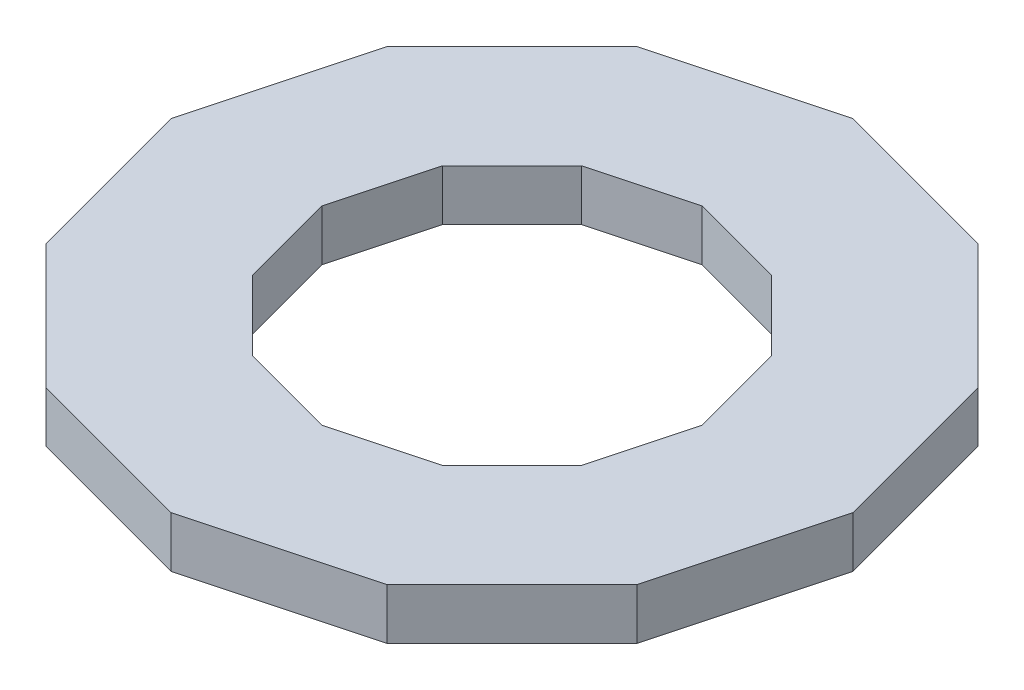
ISO-10303-21;
HEADER;
FILE_DESCRIPTION(('STEP AP214'),'2;1');
FILE_NAME('part.step','',(''),(''),'','','');
FILE_SCHEMA(('AUTOMOTIVE_DESIGN { 1 0 10303 214 1 1 1 1 }'));
ENDSEC;
DATA;
#1=APPLICATION_CONTEXT('core data for automotive mechanical design processes');
#2=APPLICATION_PROTOCOL_DEFINITION('international standard','automotive_design',2000,#1);
#3=PRODUCT_CONTEXT('',#1,'mechanical');
#4=PRODUCT('Part','Part','',(#3));
#5=PRODUCT_RELATED_PRODUCT_CATEGORY('part','',(#4));
#6=PRODUCT_DEFINITION_FORMATION('','',#4);
#7=PRODUCT_DEFINITION_CONTEXT('part definition',#1,'design');
#8=PRODUCT_DEFINITION('design','',#6,#7);
#9=PRODUCT_DEFINITION_SHAPE('','',#8);
#10=(LENGTH_UNIT() NAMED_UNIT(*) SI_UNIT(.MILLI.,.METRE.));
#11=(NAMED_UNIT(*) PLANE_ANGLE_UNIT() SI_UNIT($,.RADIAN.));
#12=(NAMED_UNIT(*) SI_UNIT($,.STERADIAN.) SOLID_ANGLE_UNIT());
#13=UNCERTAINTY_MEASURE_WITH_UNIT(LENGTH_MEASURE(1.E-05),#10,'distance_accuracy_value','');
#14=(GEOMETRIC_REPRESENTATION_CONTEXT(3) GLOBAL_UNCERTAINTY_ASSIGNED_CONTEXT((#13)) GLOBAL_UNIT_ASSIGNED_CONTEXT((#10,
#11,#12)) REPRESENTATION_CONTEXT('',''));
#15=CARTESIAN_POINT('',(0.,0.,0.));
#16=DIRECTION('',(0.,0.,1.));
#17=DIRECTION('',(1.,0.,0.));
#18=AXIS2_PLACEMENT_3D('',#15,#16,#17);
#19=CARTESIAN_POINT('',(0.,19.05,0.));
#20=DIRECTION('',(0.,1.,0.));
#21=DIRECTION('',(0.,0.,1.));
#22=AXIS2_PLACEMENT_3D('',#19,#20,#21);
#23=PLANE('',#22);
#24=DIRECTION('',(-0.25881904510252,0.,0.965925826289068));
#25=VECTOR('',#24,1.);
#26=CARTESIAN_POINT('',(-110.48707339769,19.05,-63.7897415681301));
#27=LINE('',#26,#25);
#28=CARTESIAN_POINT('',(-110.48707339769,19.05,-63.7897415681301));
#29=VERTEX_POINT('',#28);
#30=CARTESIAN_POINT('',(-127.57948313626,19.05,0.));
#31=VERTEX_POINT('',#30);
#32=EDGE_CURVE('E287',#29,#31,#27,.T.);
#33=ORIENTED_EDGE('',*,*,#32,.T.);
#34=DIRECTION('',(0.258819045102521,0.,0.965925826289068));
#35=VECTOR('',#34,1.);
#36=CARTESIAN_POINT('',(-127.57948313626,19.05,0.));
#37=LINE('',#36,#35);
#38=CARTESIAN_POINT('',(-110.48707339769,19.05,63.7897415681301));
#39=VERTEX_POINT('',#38);
#40=EDGE_CURVE('E290',#31,#39,#37,.T.);
#41=ORIENTED_EDGE('',*,*,#40,.T.);
#42=DIRECTION('',(0.707106781186548,0.,0.707106781186548));
#43=VECTOR('',#42,1.);
#44=CARTESIAN_POINT('',(-110.48707339769,19.05,63.7897415681301));
#45=LINE('',#44,#43);
#46=CARTESIAN_POINT('',(-63.78974156813,19.05,110.48707339769));
#47=VERTEX_POINT('',#46);
#48=EDGE_CURVE('E293',#39,#47,#45,.T.);
#49=ORIENTED_EDGE('',*,*,#48,.T.);
#50=DIRECTION('',(0.965925826289068,0.,0.25881904510252));
#51=VECTOR('',#50,1.);
#52=CARTESIAN_POINT('',(-63.78974156813,19.05,110.48707339769));
#53=LINE('',#52,#51);
#54=CARTESIAN_POINT('',(0.,19.05,127.57948313626));
#55=VERTEX_POINT('',#54);
#56=EDGE_CURVE('E295',#47,#55,#53,.T.);
#57=ORIENTED_EDGE('',*,*,#56,.T.);
#58=DIRECTION('',(0.965925826289068,0.,-0.258819045102521));
#59=VECTOR('',#58,1.);
#60=CARTESIAN_POINT('',(0.,19.05,127.57948313626));
#61=LINE('',#60,#59);
#62=CARTESIAN_POINT('',(63.7897415681301,19.05,110.48707339769));
#63=VERTEX_POINT('',#62);
#64=EDGE_CURVE('E297',#55,#63,#61,.T.);
#65=ORIENTED_EDGE('',*,*,#64,.T.);
#66=DIRECTION('',(0.707106781186547,0.,-0.707106781186548));
#67=VECTOR('',#66,1.);
#68=CARTESIAN_POINT('',(63.7897415681301,19.05,110.48707339769));
#69=LINE('',#68,#67);
#70=CARTESIAN_POINT('',(110.48707339769,19.05,63.78974156813));
#71=VERTEX_POINT('',#70);
#72=EDGE_CURVE('E299',#63,#71,#69,.T.);
#73=ORIENTED_EDGE('',*,*,#72,.T.);
#74=DIRECTION('',(0.25881904510252,0.,-0.965925826289068));
#75=VECTOR('',#74,1.);
#76=CARTESIAN_POINT('',(110.48707339769,19.05,63.78974156813));
#77=LINE('',#76,#75);
#78=CARTESIAN_POINT('',(127.57948313626,19.05,0.));
#79=VERTEX_POINT('',#78);
#80=EDGE_CURVE('E301',#71,#79,#77,.T.);
#81=ORIENTED_EDGE('',*,*,#80,.T.);
#82=DIRECTION('',(-0.258819045102521,0.,-0.965925826289068));
#83=VECTOR('',#82,1.);
#84=CARTESIAN_POINT('',(127.57948313626,19.05,0.));
#85=LINE('',#84,#83);
#86=CARTESIAN_POINT('',(110.48707339769,19.05,-63.78974156813));
#87=VERTEX_POINT('',#86);
#88=EDGE_CURVE('E303',#79,#87,#85,.T.);
#89=ORIENTED_EDGE('',*,*,#88,.T.);
#90=DIRECTION('',(-0.707106781186548,0.,-0.707106781186548));
#91=VECTOR('',#90,1.);
#92=CARTESIAN_POINT('',(110.48707339769,19.05,-63.78974156813));
#93=LINE('',#92,#91);
#94=CARTESIAN_POINT('',(63.78974156813,19.05,-110.48707339769));
#95=VERTEX_POINT('',#94);
#96=EDGE_CURVE('E305',#87,#95,#93,.T.);
#97=ORIENTED_EDGE('',*,*,#96,.T.);
#98=DIRECTION('',(-0.965925826289068,0.,-0.25881904510252));
#99=VECTOR('',#98,1.);
#100=CARTESIAN_POINT('',(63.78974156813,19.05,-110.48707339769));
#101=LINE('',#100,#99);
#102=CARTESIAN_POINT('',(0.,19.05,-127.57948313626));
#103=VERTEX_POINT('',#102);
#104=EDGE_CURVE('E307',#95,#103,#101,.T.);
#105=ORIENTED_EDGE('',*,*,#104,.T.);
#106=DIRECTION('',(-0.965925826289068,0.,0.258819045102521));
#107=VECTOR('',#106,1.);
#108=CARTESIAN_POINT('',(0.,19.05,-127.57948313626));
#109=LINE('',#108,#107);
#110=CARTESIAN_POINT('',(-63.7897415681301,19.05,-110.48707339769));
#111=VERTEX_POINT('',#110);
#112=EDGE_CURVE('E309',#103,#111,#109,.T.);
#113=ORIENTED_EDGE('',*,*,#112,.T.);
#114=DIRECTION('',(-0.707106781186547,0.,0.707106781186547));
#115=VECTOR('',#114,1.);
#116=CARTESIAN_POINT('',(-63.7897415681301,19.05,-110.48707339769));
#117=LINE('',#116,#115);
#118=EDGE_CURVE('E311',#111,#29,#117,.T.);
#119=ORIENTED_EDGE('',*,*,#118,.T.);
#120=EDGE_LOOP('',(#33,#41,#49,#57,#65,#73,#81,#89,#97,#105,#113,#119));
#121=FACE_BOUND('',#120,.T.);
#122=DIRECTION('',(0.258819045102521,0.,0.965925826289068));
#123=VECTOR('',#122,1.);
#124=CARTESIAN_POINT('',(-71.0430509240656,19.05,0.));
#125=LINE('',#124,#123);
#126=CARTESIAN_POINT('',(-71.0430509240656,19.05,0.));
#127=VERTEX_POINT('',#126);
#128=CARTESIAN_POINT('',(-61.5250868625923,19.05,35.5215254620328));
#129=VERTEX_POINT('',#128);
#130=EDGE_CURVE('E202',#127,#129,#125,.T.);
#131=ORIENTED_EDGE('',*,*,#130,.F.);
#132=DIRECTION('',(-0.258819045102521,0.,0.965925826289068));
#133=VECTOR('',#132,1.);
#134=CARTESIAN_POINT('',(-61.5250868625924,19.05,-35.5215254620328));
#135=LINE('',#134,#133);
#136=CARTESIAN_POINT('',(-61.5250868625924,19.05,-35.5215254620328));
#137=VERTEX_POINT('',#136);
#138=EDGE_CURVE('E194',#137,#127,#135,.T.);
#139=ORIENTED_EDGE('',*,*,#138,.F.);
#140=DIRECTION('',(-0.707106781186547,0.,0.707106781186548));
#141=VECTOR('',#140,1.);
#142=CARTESIAN_POINT('',(-35.5215254620328,19.05,-61.5250868625923));
#143=LINE('',#142,#141);
#144=CARTESIAN_POINT('',(-35.5215254620328,19.05,-61.5250868625923));
#145=VERTEX_POINT('',#144);
#146=EDGE_CURVE('E235',#145,#137,#143,.T.);
#147=ORIENTED_EDGE('',*,*,#146,.F.);
#148=DIRECTION('',(-0.965925826289068,0.,0.258819045102521));
#149=VECTOR('',#148,1.);
#150=CARTESIAN_POINT('',(0.,19.05,-71.0430509240656));
#151=LINE('',#150,#149);
#152=CARTESIAN_POINT('',(0.,19.05,-71.0430509240656));
#153=VERTEX_POINT('',#152);
#154=EDGE_CURVE('E233',#153,#145,#151,.T.);
#155=ORIENTED_EDGE('',*,*,#154,.F.);
#156=DIRECTION('',(-0.965925826289068,0.,-0.25881904510252));
#157=VECTOR('',#156,1.);
#158=CARTESIAN_POINT('',(35.5215254620329,19.05,-61.5250868625923));
#159=LINE('',#158,#157);
#160=CARTESIAN_POINT('',(35.5215254620329,19.05,-61.5250868625923));
#161=VERTEX_POINT('',#160);
#162=EDGE_CURVE('E231',#161,#153,#159,.T.);
#163=ORIENTED_EDGE('',*,*,#162,.F.);
#164=DIRECTION('',(-0.707106781186548,0.,-0.707106781186547));
#165=VECTOR('',#164,1.);
#166=CARTESIAN_POINT('',(61.5250868625924,19.05,-35.5215254620328));
#167=LINE('',#166,#165);
#168=CARTESIAN_POINT('',(61.5250868625924,19.05,-35.5215254620328));
#169=VERTEX_POINT('',#168);
#170=EDGE_CURVE('E229',#169,#161,#167,.T.);
#171=ORIENTED_EDGE('',*,*,#170,.F.);
#172=DIRECTION('',(-0.258819045102521,0.,-0.965925826289068));
#173=VECTOR('',#172,1.);
#174=CARTESIAN_POINT('',(71.0430509240656,19.05,0.));
#175=LINE('',#174,#173);
#176=CARTESIAN_POINT('',(71.0430509240656,19.05,0.));
#177=VERTEX_POINT('',#176);
#178=EDGE_CURVE('E227',#177,#169,#175,.T.);
#179=ORIENTED_EDGE('',*,*,#178,.F.);
#180=DIRECTION('',(0.25881904510252,0.,-0.965925826289069));
#181=VECTOR('',#180,1.);
#182=CARTESIAN_POINT('',(61.5250868625924,19.05,35.5215254620328));
#183=LINE('',#182,#181);
#184=CARTESIAN_POINT('',(61.5250868625924,19.05,35.5215254620328));
#185=VERTEX_POINT('',#184);
#186=EDGE_CURVE('E225',#185,#177,#183,.T.);
#187=ORIENTED_EDGE('',*,*,#186,.F.);
#188=DIRECTION('',(0.707106781186547,0.,-0.707106781186548));
#189=VECTOR('',#188,1.);
#190=CARTESIAN_POINT('',(35.5215254620328,19.05,61.5250868625923));
#191=LINE('',#190,#189);
#192=CARTESIAN_POINT('',(35.5215254620328,19.05,61.5250868625923));
#193=VERTEX_POINT('',#192);
#194=EDGE_CURVE('E223',#193,#185,#191,.T.);
#195=ORIENTED_EDGE('',*,*,#194,.F.);
#196=DIRECTION('',(0.965925826289068,0.,-0.258819045102521));
#197=VECTOR('',#196,1.);
#198=CARTESIAN_POINT('',(0.,19.05,71.0430509240656));
#199=LINE('',#198,#197);
#200=CARTESIAN_POINT('',(0.,19.05,71.0430509240656));
#201=VERTEX_POINT('',#200);
#202=EDGE_CURVE('E221',#201,#193,#199,.T.);
#203=ORIENTED_EDGE('',*,*,#202,.F.);
#204=DIRECTION('',(0.965925826289068,0.,0.25881904510252));
#205=VECTOR('',#204,1.);
#206=CARTESIAN_POINT('',(-35.5215254620328,19.05,61.5250868625924));
#207=LINE('',#206,#205);
#208=CARTESIAN_POINT('',(-35.5215254620328,19.05,61.5250868625924));
#209=VERTEX_POINT('',#208);
#210=EDGE_CURVE('E217',#209,#201,#207,.T.);
#211=ORIENTED_EDGE('',*,*,#210,.F.);
#212=DIRECTION('',(0.707106781186548,0.,0.707106781186547));
#213=VECTOR('',#212,1.);
#214=CARTESIAN_POINT('',(-61.5250868625923,19.05,35.5215254620328));
#215=LINE('',#214,#213);
#216=EDGE_CURVE('E215',#129,#209,#215,.T.);
#217=ORIENTED_EDGE('',*,*,#216,.F.);
#218=EDGE_LOOP('',(#131,#139,#147,#155,#163,#171,#179,#187,#195,#203,#211,#217));
#219=FACE_BOUND('',#218,.T.);
#220=ADVANCED_FACE('F33',(#121,#219),#23,.T.);
#221=CARTESIAN_POINT('',(0.,0.,0.));
#222=DIRECTION('',(0.,1.,0.));
#223=DIRECTION('',(0.,0.,1.));
#224=AXIS2_PLACEMENT_3D('',#221,#222,#223);
#225=PLANE('',#224);
#226=DIRECTION('',(-0.25881904510252,0.,0.965925826289068));
#227=VECTOR('',#226,1.);
#228=CARTESIAN_POINT('',(-110.48707339769,0.,-63.7897415681301));
#229=LINE('',#228,#227);
#230=CARTESIAN_POINT('',(-110.48707339769,0.,-63.7897415681301));
#231=VERTEX_POINT('',#230);
#232=CARTESIAN_POINT('',(-127.57948313626,0.,0.));
#233=VERTEX_POINT('',#232);
#234=EDGE_CURVE('E210',#231,#233,#229,.T.);
#235=ORIENTED_EDGE('',*,*,#234,.F.);
#236=DIRECTION('',(-0.707106781186547,0.,0.707106781186547));
#237=VECTOR('',#236,1.);
#238=CARTESIAN_POINT('',(-63.7897415681301,0.,-110.48707339769));
#239=LINE('',#238,#237);
#240=CARTESIAN_POINT('',(-63.7897415681301,0.,-110.48707339769));
#241=VERTEX_POINT('',#240);
#242=EDGE_CURVE('E291',#241,#231,#239,.T.);
#243=ORIENTED_EDGE('',*,*,#242,.F.);
#244=DIRECTION('',(-0.965925826289068,0.,0.258819045102521));
#245=VECTOR('',#244,1.);
#246=CARTESIAN_POINT('',(0.,0.,-127.57948313626));
#247=LINE('',#246,#245);
#248=CARTESIAN_POINT('',(0.,0.,-127.57948313626));
#249=VERTEX_POINT('',#248);
#250=EDGE_CURVE('E334',#249,#241,#247,.T.);
#251=ORIENTED_EDGE('',*,*,#250,.F.);
#252=DIRECTION('',(-0.965925826289068,0.,-0.25881904510252));
#253=VECTOR('',#252,1.);
#254=CARTESIAN_POINT('',(63.78974156813,0.,-110.48707339769));
#255=LINE('',#254,#253);
#256=CARTESIAN_POINT('',(63.78974156813,0.,-110.48707339769));
#257=VERTEX_POINT('',#256);
#258=EDGE_CURVE('E332',#257,#249,#255,.T.);
#259=ORIENTED_EDGE('',*,*,#258,.F.);
#260=DIRECTION('',(-0.707106781186548,0.,-0.707106781186548));
#261=VECTOR('',#260,1.);
#262=CARTESIAN_POINT('',(110.48707339769,0.,-63.78974156813));
#263=LINE('',#262,#261);
#264=CARTESIAN_POINT('',(110.48707339769,0.,-63.78974156813));
#265=VERTEX_POINT('',#264);
#266=EDGE_CURVE('E330',#265,#257,#263,.T.);
#267=ORIENTED_EDGE('',*,*,#266,.F.);
#268=DIRECTION('',(-0.258819045102521,0.,-0.965925826289068));
#269=VECTOR('',#268,1.);
#270=CARTESIAN_POINT('',(127.57948313626,0.,0.));
#271=LINE('',#270,#269);
#272=CARTESIAN_POINT('',(127.57948313626,0.,0.));
#273=VERTEX_POINT('',#272);
#274=EDGE_CURVE('E328',#273,#265,#271,.T.);
#275=ORIENTED_EDGE('',*,*,#274,.F.);
#276=DIRECTION('',(0.25881904510252,0.,-0.965925826289068));
#277=VECTOR('',#276,1.);
#278=CARTESIAN_POINT('',(110.48707339769,0.,63.78974156813));
#279=LINE('',#278,#277);
#280=CARTESIAN_POINT('',(110.48707339769,0.,63.78974156813));
#281=VERTEX_POINT('',#280);
#282=EDGE_CURVE('E326',#281,#273,#279,.T.);
#283=ORIENTED_EDGE('',*,*,#282,.F.);
#284=DIRECTION('',(0.707106781186547,0.,-0.707106781186548));
#285=VECTOR('',#284,1.);
#286=CARTESIAN_POINT('',(63.7897415681301,0.,110.48707339769));
#287=LINE('',#286,#285);
#288=CARTESIAN_POINT('',(63.7897415681301,0.,110.48707339769));
#289=VERTEX_POINT('',#288);
#290=EDGE_CURVE('E324',#289,#281,#287,.T.);
#291=ORIENTED_EDGE('',*,*,#290,.F.);
#292=DIRECTION('',(0.965925826289068,0.,-0.258819045102521));
#293=VECTOR('',#292,1.);
#294=CARTESIAN_POINT('',(0.,0.,127.57948313626));
#295=LINE('',#294,#293);
#296=CARTESIAN_POINT('',(0.,0.,127.57948313626));
#297=VERTEX_POINT('',#296);
#298=EDGE_CURVE('E322',#297,#289,#295,.T.);
#299=ORIENTED_EDGE('',*,*,#298,.F.);
#300=DIRECTION('',(0.965925826289068,0.,0.25881904510252));
#301=VECTOR('',#300,1.);
#302=CARTESIAN_POINT('',(-63.78974156813,0.,110.48707339769));
#303=LINE('',#302,#301);
#304=CARTESIAN_POINT('',(-63.78974156813,0.,110.48707339769));
#305=VERTEX_POINT('',#304);
#306=EDGE_CURVE('E320',#305,#297,#303,.T.);
#307=ORIENTED_EDGE('',*,*,#306,.F.);
#308=DIRECTION('',(0.707106781186548,0.,0.707106781186548));
#309=VECTOR('',#308,1.);
#310=CARTESIAN_POINT('',(-110.48707339769,0.,63.7897415681301));
#311=LINE('',#310,#309);
#312=CARTESIAN_POINT('',(-110.48707339769,0.,63.7897415681301));
#313=VERTEX_POINT('',#312);
#314=EDGE_CURVE('E318',#313,#305,#311,.T.);
#315=ORIENTED_EDGE('',*,*,#314,.F.);
#316=DIRECTION('',(0.258819045102521,0.,0.965925826289068));
#317=VECTOR('',#316,1.);
#318=CARTESIAN_POINT('',(-127.57948313626,0.,0.));
#319=LINE('',#318,#317);
#320=EDGE_CURVE('E316',#233,#313,#319,.T.);
#321=ORIENTED_EDGE('',*,*,#320,.F.);
#322=EDGE_LOOP('',(#235,#243,#251,#259,#267,#275,#283,#291,#299,#307,#315,#321));
#323=FACE_BOUND('',#322,.T.);
#324=DIRECTION('',(-0.258819045102521,0.,0.965925826289068));
#325=VECTOR('',#324,1.);
#326=CARTESIAN_POINT('',(-61.5250868625924,0.,-35.5215254620328));
#327=LINE('',#326,#325);
#328=CARTESIAN_POINT('',(-61.5250868625924,0.,-35.5215254620328));
#329=VERTEX_POINT('',#328);
#330=CARTESIAN_POINT('',(-71.0430509240656,0.,0.));
#331=VERTEX_POINT('',#330);
#332=EDGE_CURVE('E56',#329,#331,#327,.T.);
#333=ORIENTED_EDGE('',*,*,#332,.T.);
#334=DIRECTION('',(0.258819045102521,0.,0.965925826289068));
#335=VECTOR('',#334,1.);
#336=CARTESIAN_POINT('',(-71.0430509240656,0.,0.));
#337=LINE('',#336,#335);
#338=CARTESIAN_POINT('',(-61.5250868625923,0.,35.5215254620328));
#339=VERTEX_POINT('',#338);
#340=EDGE_CURVE('E209',#331,#339,#337,.T.);
#341=ORIENTED_EDGE('',*,*,#340,.T.);
#342=DIRECTION('',(0.707106781186548,0.,0.707106781186547));
#343=VECTOR('',#342,1.);
#344=CARTESIAN_POINT('',(-61.5250868625923,0.,35.5215254620328));
#345=LINE('',#344,#343);
#346=CARTESIAN_POINT('',(-35.5215254620328,0.,61.5250868625924));
#347=VERTEX_POINT('',#346);
#348=EDGE_CURVE('E239',#339,#347,#345,.T.);
#349=ORIENTED_EDGE('',*,*,#348,.T.);
#350=DIRECTION('',(0.965925826289068,0.,0.25881904510252));
#351=VECTOR('',#350,1.);
#352=CARTESIAN_POINT('',(-35.5215254620328,0.,61.5250868625924));
#353=LINE('',#352,#351);
#354=CARTESIAN_POINT('',(0.,0.,71.0430509240656));
#355=VERTEX_POINT('',#354);
#356=EDGE_CURVE('E242',#347,#355,#353,.T.);
#357=ORIENTED_EDGE('',*,*,#356,.T.);
#358=DIRECTION('',(0.965925826289068,0.,-0.258819045102521));
#359=VECTOR('',#358,1.);
#360=CARTESIAN_POINT('',(0.,0.,71.0430509240656));
#361=LINE('',#360,#359);
#362=CARTESIAN_POINT('',(35.5215254620328,0.,61.5250868625923));
#363=VERTEX_POINT('',#362);
#364=EDGE_CURVE('E245',#355,#363,#361,.T.);
#365=ORIENTED_EDGE('',*,*,#364,.T.);
#366=DIRECTION('',(0.707106781186547,0.,-0.707106781186548));
#367=VECTOR('',#366,1.);
#368=CARTESIAN_POINT('',(35.5215254620328,0.,61.5250868625923));
#369=LINE('',#368,#367);
#370=CARTESIAN_POINT('',(61.5250868625924,0.,35.5215254620328));
#371=VERTEX_POINT('',#370);
#372=EDGE_CURVE('E248',#363,#371,#369,.T.);
#373=ORIENTED_EDGE('',*,*,#372,.T.);
#374=DIRECTION('',(0.25881904510252,0.,-0.965925826289069));
#375=VECTOR('',#374,1.);
#376=CARTESIAN_POINT('',(61.5250868625924,0.,35.5215254620328));
#377=LINE('',#376,#375);
#378=CARTESIAN_POINT('',(71.0430509240656,0.,0.));
#379=VERTEX_POINT('',#378);
#380=EDGE_CURVE('E251',#371,#379,#377,.T.);
#381=ORIENTED_EDGE('',*,*,#380,.T.);
#382=DIRECTION('',(-0.258819045102521,0.,-0.965925826289068));
#383=VECTOR('',#382,1.);
#384=CARTESIAN_POINT('',(71.0430509240656,0.,0.));
#385=LINE('',#384,#383);
#386=CARTESIAN_POINT('',(61.5250868625924,0.,-35.5215254620328));
#387=VERTEX_POINT('',#386);
#388=EDGE_CURVE('E254',#379,#387,#385,.T.);
#389=ORIENTED_EDGE('',*,*,#388,.T.);
#390=DIRECTION('',(-0.707106781186548,0.,-0.707106781186547));
#391=VECTOR('',#390,1.);
#392=CARTESIAN_POINT('',(61.5250868625924,0.,-35.5215254620328));
#393=LINE('',#392,#391);
#394=CARTESIAN_POINT('',(35.5215254620329,0.,-61.5250868625923));
#395=VERTEX_POINT('',#394);
#396=EDGE_CURVE('E257',#387,#395,#393,.T.);
#397=ORIENTED_EDGE('',*,*,#396,.T.);
#398=DIRECTION('',(-0.965925826289068,0.,-0.25881904510252));
#399=VECTOR('',#398,1.);
#400=CARTESIAN_POINT('',(35.5215254620329,0.,-61.5250868625923));
#401=LINE('',#400,#399);
#402=CARTESIAN_POINT('',(0.,0.,-71.0430509240656));
#403=VERTEX_POINT('',#402);
#404=EDGE_CURVE('E260',#395,#403,#401,.T.);
#405=ORIENTED_EDGE('',*,*,#404,.T.);
#406=DIRECTION('',(-0.965925826289068,0.,0.258819045102521));
#407=VECTOR('',#406,1.);
#408=CARTESIAN_POINT('',(0.,0.,-71.0430509240656));
#409=LINE('',#408,#407);
#410=CARTESIAN_POINT('',(-35.5215254620328,0.,-61.5250868625923));
#411=VERTEX_POINT('',#410);
#412=EDGE_CURVE('E263',#403,#411,#409,.T.);
#413=ORIENTED_EDGE('',*,*,#412,.T.);
#414=DIRECTION('',(-0.707106781186547,0.,0.707106781186548));
#415=VECTOR('',#414,1.);
#416=CARTESIAN_POINT('',(-35.5215254620328,0.,-61.5250868625923));
#417=LINE('',#416,#415);
#418=EDGE_CURVE('E203',#411,#329,#417,.T.);
#419=ORIENTED_EDGE('',*,*,#418,.T.);
#420=EDGE_LOOP('',(#333,#341,#349,#357,#365,#373,#381,#389,#397,#405,#413,#419));
#421=FACE_BOUND('',#420,.T.);
#422=ADVANCED_FACE('F376',(#323,#421),#225,.F.);
#423=CARTESIAN_POINT('',(-110.48707339769,19.05,-63.7897415681301));
#424=DIRECTION('',(0.965925826289068,0.,0.25881904510252));
#425=DIRECTION('',(0.258819045102521,0.,-0.965925826289069));
#426=AXIS2_PLACEMENT_3D('',#423,#424,#425);
#427=PLANE('',#426);
#428=ORIENTED_EDGE('',*,*,#234,.T.);
#429=DIRECTION('',(0.,-1.,0.));
#430=VECTOR('',#429,1.);
#431=CARTESIAN_POINT('',(-127.57948313626,19.05,0.));
#432=LINE('',#431,#430);
#433=EDGE_CURVE('E11',#31,#233,#432,.T.);
#434=ORIENTED_EDGE('',*,*,#433,.F.);
#435=ORIENTED_EDGE('',*,*,#32,.F.);
#436=DIRECTION('',(0.,-1.,0.));
#437=VECTOR('',#436,1.);
#438=CARTESIAN_POINT('',(-110.48707339769,19.05,-63.7897415681301));
#439=LINE('',#438,#437);
#440=EDGE_CURVE('E313',#29,#231,#439,.T.);
#441=ORIENTED_EDGE('',*,*,#440,.T.);
#442=EDGE_LOOP('',(#428,#434,#435,#441));
#443=FACE_BOUND('',#442,.T.);
#444=ADVANCED_FACE('F35',(#443),#427,.F.);
#445=CARTESIAN_POINT('',(-127.57948313626,19.05,0.));
#446=DIRECTION('',(0.965925826289068,0.,-0.258819045102521));
#447=DIRECTION('',(-0.258819045102521,0.,-0.965925826289068));
#448=AXIS2_PLACEMENT_3D('',#445,#446,#447);
#449=PLANE('',#448);
#450=ORIENTED_EDGE('',*,*,#320,.T.);
#451=DIRECTION('',(0.,-1.,0.));
#452=VECTOR('',#451,1.);
#453=CARTESIAN_POINT('',(-110.48707339769,19.05,63.7897415681301));
#454=LINE('',#453,#452);
#455=EDGE_CURVE('E41',#39,#313,#454,.T.);
#456=ORIENTED_EDGE('',*,*,#455,.F.);
#457=ORIENTED_EDGE('',*,*,#40,.F.);
#458=ORIENTED_EDGE('',*,*,#433,.T.);
#459=EDGE_LOOP('',(#450,#456,#457,#458));
#460=FACE_BOUND('',#459,.T.);
#461=ADVANCED_FACE('F393',(#460),#449,.F.);
#462=CARTESIAN_POINT('',(-110.48707339769,19.05,63.7897415681301));
#463=DIRECTION('',(0.707106781186548,0.,-0.707106781186548));
#464=DIRECTION('',(-0.707106781186548,0.,-0.707106781186548));
#465=AXIS2_PLACEMENT_3D('',#462,#463,#464);
#466=PLANE('',#465);
#467=ORIENTED_EDGE('',*,*,#314,.T.);
#468=DIRECTION('',(0.,-1.,0.));
#469=VECTOR('',#468,1.);
#470=CARTESIAN_POINT('',(-63.78974156813,19.05,110.48707339769));
#471=LINE('',#470,#469);
#472=EDGE_CURVE('E363',#47,#305,#471,.T.);
#473=ORIENTED_EDGE('',*,*,#472,.F.);
#474=ORIENTED_EDGE('',*,*,#48,.F.);
#475=ORIENTED_EDGE('',*,*,#455,.T.);
#476=EDGE_LOOP('',(#467,#473,#474,#475));
#477=FACE_BOUND('',#476,.T.);
#478=ADVANCED_FACE('F370',(#477),#466,.F.);
#479=CARTESIAN_POINT('',(-63.78974156813,19.05,110.48707339769));
#480=DIRECTION('',(0.25881904510252,0.,-0.965925826289069));
#481=DIRECTION('',(-0.965925826289069,0.,-0.25881904510252));
#482=AXIS2_PLACEMENT_3D('',#479,#480,#481);
#483=PLANE('',#482);
#484=ORIENTED_EDGE('',*,*,#306,.T.);
#485=DIRECTION('',(0.,-1.,0.));
#486=VECTOR('',#485,1.);
#487=CARTESIAN_POINT('',(0.,19.05,127.57948313626));
#488=LINE('',#487,#486);
#489=EDGE_CURVE('E360',#55,#297,#488,.T.);
#490=ORIENTED_EDGE('',*,*,#489,.F.);
#491=ORIENTED_EDGE('',*,*,#56,.F.);
#492=ORIENTED_EDGE('',*,*,#472,.T.);
#493=EDGE_LOOP('',(#484,#490,#491,#492));
#494=FACE_BOUND('',#493,.T.);
#495=ADVANCED_FACE('F382',(#494),#483,.F.);
#496=CARTESIAN_POINT('',(0.,19.05,127.57948313626));
#497=DIRECTION('',(-0.258819045102521,0.,-0.965925826289068));
#498=DIRECTION('',(-0.965925826289068,0.,0.258819045102521));
#499=AXIS2_PLACEMENT_3D('',#496,#497,#498);
#500=PLANE('',#499);
#501=ORIENTED_EDGE('',*,*,#298,.T.);
#502=DIRECTION('',(0.,-1.,0.));
#503=VECTOR('',#502,1.);
#504=CARTESIAN_POINT('',(63.7897415681301,19.05,110.48707339769));
#505=LINE('',#504,#503);
#506=EDGE_CURVE('E357',#63,#289,#505,.T.);
#507=ORIENTED_EDGE('',*,*,#506,.F.);
#508=ORIENTED_EDGE('',*,*,#64,.F.);
#509=ORIENTED_EDGE('',*,*,#489,.T.);
#510=EDGE_LOOP('',(#501,#507,#508,#509));
#511=FACE_BOUND('',#510,.T.);
#512=ADVANCED_FACE('F386',(#511),#500,.F.);
#513=CARTESIAN_POINT('',(63.7897415681301,19.05,110.48707339769));
#514=DIRECTION('',(-0.707106781186548,0.,-0.707106781186547));
#515=DIRECTION('',(-0.707106781186547,0.,0.707106781186548));
#516=AXIS2_PLACEMENT_3D('',#513,#514,#515);
#517=PLANE('',#516);
#518=ORIENTED_EDGE('',*,*,#290,.T.);
#519=DIRECTION('',(0.,-1.,0.));
#520=VECTOR('',#519,1.);
#521=CARTESIAN_POINT('',(110.48707339769,19.05,63.78974156813));
#522=LINE('',#521,#520);
#523=EDGE_CURVE('E354',#71,#281,#522,.T.);
#524=ORIENTED_EDGE('',*,*,#523,.F.);
#525=ORIENTED_EDGE('',*,*,#72,.F.);
#526=ORIENTED_EDGE('',*,*,#506,.T.);
#527=EDGE_LOOP('',(#518,#524,#525,#526));
#528=FACE_BOUND('',#527,.T.);
#529=ADVANCED_FACE('F426',(#528),#517,.F.);
#530=CARTESIAN_POINT('',(110.48707339769,19.05,63.78974156813));
#531=DIRECTION('',(-0.965925826289069,0.,-0.25881904510252));
#532=DIRECTION('',(-0.25881904510252,0.,0.965925826289069));
#533=AXIS2_PLACEMENT_3D('',#530,#531,#532);
#534=PLANE('',#533);
#535=ORIENTED_EDGE('',*,*,#282,.T.);
#536=DIRECTION('',(0.,-1.,0.));
#537=VECTOR('',#536,1.);
#538=CARTESIAN_POINT('',(127.57948313626,19.05,0.));
#539=LINE('',#538,#537);
#540=EDGE_CURVE('E351',#79,#273,#539,.T.);
#541=ORIENTED_EDGE('',*,*,#540,.F.);
#542=ORIENTED_EDGE('',*,*,#80,.F.);
#543=ORIENTED_EDGE('',*,*,#523,.T.);
#544=EDGE_LOOP('',(#535,#541,#542,#543));
#545=FACE_BOUND('',#544,.T.);
#546=ADVANCED_FACE('F424',(#545),#534,.F.);
#547=CARTESIAN_POINT('',(127.57948313626,19.05,0.));
#548=DIRECTION('',(-0.965925826289068,0.,0.258819045102521));
#549=DIRECTION('',(0.258819045102521,0.,0.965925826289068));
#550=AXIS2_PLACEMENT_3D('',#547,#548,#549);
#551=PLANE('',#550);
#552=ORIENTED_EDGE('',*,*,#274,.T.);
#553=DIRECTION('',(0.,-1.,0.));
#554=VECTOR('',#553,1.);
#555=CARTESIAN_POINT('',(110.48707339769,19.05,-63.78974156813));
#556=LINE('',#555,#554);
#557=EDGE_CURVE('E348',#87,#265,#556,.T.);
#558=ORIENTED_EDGE('',*,*,#557,.F.);
#559=ORIENTED_EDGE('',*,*,#88,.F.);
#560=ORIENTED_EDGE('',*,*,#540,.T.);
#561=EDGE_LOOP('',(#552,#558,#559,#560));
#562=FACE_BOUND('',#561,.T.);
#563=ADVANCED_FACE('F420',(#562),#551,.F.);
#564=CARTESIAN_POINT('',(110.48707339769,19.05,-63.78974156813));
#565=DIRECTION('',(-0.707106781186548,0.,0.707106781186548));
#566=DIRECTION('',(0.707106781186548,0.,0.707106781186548));
#567=AXIS2_PLACEMENT_3D('',#564,#565,#566);
#568=PLANE('',#567);
#569=ORIENTED_EDGE('',*,*,#266,.T.);
#570=DIRECTION('',(0.,-1.,0.));
#571=VECTOR('',#570,1.);
#572=CARTESIAN_POINT('',(63.78974156813,19.05,-110.48707339769));
#573=LINE('',#572,#571);
#574=EDGE_CURVE('E345',#95,#257,#573,.T.);
#575=ORIENTED_EDGE('',*,*,#574,.F.);
#576=ORIENTED_EDGE('',*,*,#96,.F.);
#577=ORIENTED_EDGE('',*,*,#557,.T.);
#578=EDGE_LOOP('',(#569,#575,#576,#577));
#579=FACE_BOUND('',#578,.T.);
#580=ADVANCED_FACE('F415',(#579),#568,.F.);
#581=CARTESIAN_POINT('',(63.78974156813,19.05,-110.48707339769));
#582=DIRECTION('',(-0.25881904510252,0.,0.965925826289068));
#583=DIRECTION('',(0.965925826289069,0.,0.25881904510252));
#584=AXIS2_PLACEMENT_3D('',#581,#582,#583);
#585=PLANE('',#584);
#586=ORIENTED_EDGE('',*,*,#258,.T.);
#587=DIRECTION('',(0.,-1.,0.));
#588=VECTOR('',#587,1.);
#589=CARTESIAN_POINT('',(0.,19.05,-127.57948313626));
#590=LINE('',#589,#588);
#591=EDGE_CURVE('E342',#103,#249,#590,.T.);
#592=ORIENTED_EDGE('',*,*,#591,.F.);
#593=ORIENTED_EDGE('',*,*,#104,.F.);
#594=ORIENTED_EDGE('',*,*,#574,.T.);
#595=EDGE_LOOP('',(#586,#592,#593,#594));
#596=FACE_BOUND('',#595,.T.);
#597=ADVANCED_FACE('F409',(#596),#585,.F.);
#598=CARTESIAN_POINT('',(0.,19.05,-127.57948313626));
#599=DIRECTION('',(0.258819045102521,0.,0.965925826289068));
#600=DIRECTION('',(0.965925826289068,0.,-0.258819045102521));
#601=AXIS2_PLACEMENT_3D('',#598,#599,#600);
#602=PLANE('',#601);
#603=ORIENTED_EDGE('',*,*,#250,.T.);
#604=DIRECTION('',(0.,-1.,0.));
#605=VECTOR('',#604,1.);
#606=CARTESIAN_POINT('',(-63.7897415681301,19.05,-110.48707339769));
#607=LINE('',#606,#605);
#608=EDGE_CURVE('E339',#111,#241,#607,.T.);
#609=ORIENTED_EDGE('',*,*,#608,.F.);
#610=ORIENTED_EDGE('',*,*,#112,.F.);
#611=ORIENTED_EDGE('',*,*,#591,.T.);
#612=EDGE_LOOP('',(#603,#609,#610,#611));
#613=FACE_BOUND('',#612,.T.);
#614=ADVANCED_FACE('F405',(#613),#602,.F.);
#615=CARTESIAN_POINT('',(-63.7897415681301,19.05,-110.48707339769));
#616=DIRECTION('',(0.707106781186548,0.,0.707106781186548));
#617=DIRECTION('',(0.707106781186548,0.,-0.707106781186548));
#618=AXIS2_PLACEMENT_3D('',#615,#616,#617);
#619=PLANE('',#618);
#620=ORIENTED_EDGE('',*,*,#242,.T.);
#621=ORIENTED_EDGE('',*,*,#440,.F.);
#622=ORIENTED_EDGE('',*,*,#118,.F.);
#623=ORIENTED_EDGE('',*,*,#608,.T.);
#624=EDGE_LOOP('',(#620,#621,#622,#623));
#625=FACE_BOUND('',#624,.T.);
#626=ADVANCED_FACE('F400',(#625),#619,.F.);
#627=CARTESIAN_POINT('',(-61.5250868625924,19.05,-35.5215254620328));
#628=DIRECTION('',(0.965925826289068,0.,0.258819045102521));
#629=DIRECTION('',(0.258819045102521,0.,-0.965925826289068));
#630=AXIS2_PLACEMENT_3D('',#627,#628,#629);
#631=PLANE('',#630);
#632=ORIENTED_EDGE('',*,*,#332,.F.);
#633=DIRECTION('',(0.,-1.,0.));
#634=VECTOR('',#633,1.);
#635=CARTESIAN_POINT('',(-61.5250868625924,19.05,-35.5215254620328));
#636=LINE('',#635,#634);
#637=EDGE_CURVE('E198',#137,#329,#636,.T.);
#638=ORIENTED_EDGE('',*,*,#637,.F.);
#639=ORIENTED_EDGE('',*,*,#138,.T.);
#640=DIRECTION('',(0.,-1.,0.));
#641=VECTOR('',#640,1.);
#642=CARTESIAN_POINT('',(-71.0430509240656,19.05,0.));
#643=LINE('',#642,#641);
#644=EDGE_CURVE('E197',#127,#331,#643,.T.);
#645=ORIENTED_EDGE('',*,*,#644,.T.);
#646=EDGE_LOOP('',(#632,#638,#639,#645));
#647=FACE_BOUND('',#646,.T.);
#648=ADVANCED_FACE('F196',(#647),#631,.T.);
#649=CARTESIAN_POINT('',(-71.0430509240656,19.05,0.));
#650=DIRECTION('',(0.965925826289068,0.,-0.258819045102521));
#651=DIRECTION('',(-0.258819045102521,0.,-0.965925826289068));
#652=AXIS2_PLACEMENT_3D('',#649,#650,#651);
#653=PLANE('',#652);
#654=ORIENTED_EDGE('',*,*,#340,.F.);
#655=ORIENTED_EDGE('',*,*,#644,.F.);
#656=ORIENTED_EDGE('',*,*,#130,.T.);
#657=DIRECTION('',(0.,-1.,0.));
#658=VECTOR('',#657,1.);
#659=CARTESIAN_POINT('',(-61.5250868625923,19.05,35.5215254620328));
#660=LINE('',#659,#658);
#661=EDGE_CURVE('E211',#129,#339,#660,.T.);
#662=ORIENTED_EDGE('',*,*,#661,.T.);
#663=EDGE_LOOP('',(#654,#655,#656,#662));
#664=FACE_BOUND('',#663,.T.);
#665=ADVANCED_FACE('F206',(#664),#653,.T.);
#666=CARTESIAN_POINT('',(-61.5250868625923,19.05,35.5215254620328));
#667=DIRECTION('',(0.707106781186547,0.,-0.707106781186548));
#668=DIRECTION('',(-0.707106781186548,0.,-0.707106781186547));
#669=AXIS2_PLACEMENT_3D('',#666,#667,#668);
#670=PLANE('',#669);
#671=ORIENTED_EDGE('',*,*,#348,.F.);
#672=ORIENTED_EDGE('',*,*,#661,.F.);
#673=ORIENTED_EDGE('',*,*,#216,.T.);
#674=DIRECTION('',(0.,-1.,0.));
#675=VECTOR('',#674,1.);
#676=CARTESIAN_POINT('',(-35.5215254620328,19.05,61.5250868625924));
#677=LINE('',#676,#675);
#678=EDGE_CURVE('E284',#209,#347,#677,.T.);
#679=ORIENTED_EDGE('',*,*,#678,.T.);
#680=EDGE_LOOP('',(#671,#672,#673,#679));
#681=FACE_BOUND('',#680,.T.);
#682=ADVANCED_FACE('F484',(#681),#670,.T.);
#683=CARTESIAN_POINT('',(-35.5215254620328,19.05,61.5250868625924));
#684=DIRECTION('',(0.25881904510252,0.,-0.965925826289068));
#685=DIRECTION('',(-0.965925826289068,0.,-0.25881904510252));
#686=AXIS2_PLACEMENT_3D('',#683,#684,#685);
#687=PLANE('',#686);
#688=ORIENTED_EDGE('',*,*,#356,.F.);
#689=ORIENTED_EDGE('',*,*,#678,.F.);
#690=ORIENTED_EDGE('',*,*,#210,.T.);
#691=DIRECTION('',(0.,-1.,0.));
#692=VECTOR('',#691,1.);
#693=CARTESIAN_POINT('',(0.,19.05,71.0430509240656));
#694=LINE('',#693,#692);
#695=EDGE_CURVE('E282',#201,#355,#694,.T.);
#696=ORIENTED_EDGE('',*,*,#695,.T.);
#697=EDGE_LOOP('',(#688,#689,#690,#696));
#698=FACE_BOUND('',#697,.T.);
#699=ADVANCED_FACE('F490',(#698),#687,.T.);
#700=CARTESIAN_POINT('',(0.,19.05,71.0430509240656));
#701=DIRECTION('',(-0.258819045102521,0.,-0.965925826289068));
#702=DIRECTION('',(-0.965925826289068,0.,0.258819045102521));
#703=AXIS2_PLACEMENT_3D('',#700,#701,#702);
#704=PLANE('',#703);
#705=ORIENTED_EDGE('',*,*,#364,.F.);
#706=ORIENTED_EDGE('',*,*,#695,.F.);
#707=ORIENTED_EDGE('',*,*,#202,.T.);
#708=DIRECTION('',(0.,-1.,0.));
#709=VECTOR('',#708,1.);
#710=CARTESIAN_POINT('',(35.5215254620328,19.05,61.5250868625923));
#711=LINE('',#710,#709);
#712=EDGE_CURVE('E280',#193,#363,#711,.T.);
#713=ORIENTED_EDGE('',*,*,#712,.T.);
#714=EDGE_LOOP('',(#705,#706,#707,#713));
#715=FACE_BOUND('',#714,.T.);
#716=ADVANCED_FACE('F498',(#715),#704,.T.);
#717=CARTESIAN_POINT('',(35.5215254620328,19.05,61.5250868625923));
#718=DIRECTION('',(-0.707106781186548,0.,-0.707106781186547));
#719=DIRECTION('',(-0.707106781186547,0.,0.707106781186548));
#720=AXIS2_PLACEMENT_3D('',#717,#718,#719);
#721=PLANE('',#720);
#722=ORIENTED_EDGE('',*,*,#372,.F.);
#723=ORIENTED_EDGE('',*,*,#712,.F.);
#724=ORIENTED_EDGE('',*,*,#194,.T.);
#725=DIRECTION('',(0.,-1.,0.));
#726=VECTOR('',#725,1.);
#727=CARTESIAN_POINT('',(61.5250868625924,19.05,35.5215254620328));
#728=LINE('',#727,#726);
#729=EDGE_CURVE('E278',#185,#371,#728,.T.);
#730=ORIENTED_EDGE('',*,*,#729,.T.);
#731=EDGE_LOOP('',(#722,#723,#724,#730));
#732=FACE_BOUND('',#731,.T.);
#733=ADVANCED_FACE('F506',(#732),#721,.T.);
#734=CARTESIAN_POINT('',(61.5250868625924,19.05,35.5215254620328));
#735=DIRECTION('',(-0.965925826289068,0.,-0.25881904510252));
#736=DIRECTION('',(-0.25881904510252,0.,0.965925826289069));
#737=AXIS2_PLACEMENT_3D('',#734,#735,#736);
#738=PLANE('',#737);
#739=ORIENTED_EDGE('',*,*,#380,.F.);
#740=ORIENTED_EDGE('',*,*,#729,.F.);
#741=ORIENTED_EDGE('',*,*,#186,.T.);
#742=DIRECTION('',(0.,-1.,0.));
#743=VECTOR('',#742,1.);
#744=CARTESIAN_POINT('',(71.0430509240656,19.05,0.));
#745=LINE('',#744,#743);
#746=EDGE_CURVE('E276',#177,#379,#745,.T.);
#747=ORIENTED_EDGE('',*,*,#746,.T.);
#748=EDGE_LOOP('',(#739,#740,#741,#747));
#749=FACE_BOUND('',#748,.T.);
#750=ADVANCED_FACE('F514',(#749),#738,.T.);
#751=CARTESIAN_POINT('',(71.0430509240656,19.05,0.));
#752=DIRECTION('',(-0.965925826289068,0.,0.258819045102521));
#753=DIRECTION('',(0.258819045102521,0.,0.965925826289068));
#754=AXIS2_PLACEMENT_3D('',#751,#752,#753);
#755=PLANE('',#754);
#756=ORIENTED_EDGE('',*,*,#388,.F.);
#757=ORIENTED_EDGE('',*,*,#746,.F.);
#758=ORIENTED_EDGE('',*,*,#178,.T.);
#759=DIRECTION('',(0.,-1.,0.));
#760=VECTOR('',#759,1.);
#761=CARTESIAN_POINT('',(61.5250868625924,19.05,-35.5215254620328));
#762=LINE('',#761,#760);
#763=EDGE_CURVE('E274',#169,#387,#762,.T.);
#764=ORIENTED_EDGE('',*,*,#763,.T.);
#765=EDGE_LOOP('',(#756,#757,#758,#764));
#766=FACE_BOUND('',#765,.T.);
#767=ADVANCED_FACE('F522',(#766),#755,.T.);
#768=CARTESIAN_POINT('',(61.5250868625924,19.05,-35.5215254620328));
#769=DIRECTION('',(-0.707106781186547,0.,0.707106781186548));
#770=DIRECTION('',(0.707106781186548,0.,0.707106781186547));
#771=AXIS2_PLACEMENT_3D('',#768,#769,#770);
#772=PLANE('',#771);
#773=ORIENTED_EDGE('',*,*,#396,.F.);
#774=ORIENTED_EDGE('',*,*,#763,.F.);
#775=ORIENTED_EDGE('',*,*,#170,.T.);
#776=DIRECTION('',(0.,-1.,0.));
#777=VECTOR('',#776,1.);
#778=CARTESIAN_POINT('',(35.5215254620329,19.05,-61.5250868625923));
#779=LINE('',#778,#777);
#780=EDGE_CURVE('E272',#161,#395,#779,.T.);
#781=ORIENTED_EDGE('',*,*,#780,.T.);
#782=EDGE_LOOP('',(#773,#774,#775,#781));
#783=FACE_BOUND('',#782,.T.);
#784=ADVANCED_FACE('F530',(#783),#772,.T.);
#785=CARTESIAN_POINT('',(35.5215254620329,19.05,-61.5250868625923));
#786=DIRECTION('',(-0.25881904510252,0.,0.965925826289068));
#787=DIRECTION('',(0.965925826289069,0.,0.25881904510252));
#788=AXIS2_PLACEMENT_3D('',#785,#786,#787);
#789=PLANE('',#788);
#790=ORIENTED_EDGE('',*,*,#404,.F.);
#791=ORIENTED_EDGE('',*,*,#780,.F.);
#792=ORIENTED_EDGE('',*,*,#162,.T.);
#793=DIRECTION('',(0.,-1.,0.));
#794=VECTOR('',#793,1.);
#795=CARTESIAN_POINT('',(0.,19.05,-71.0430509240656));
#796=LINE('',#795,#794);
#797=EDGE_CURVE('E270',#153,#403,#796,.T.);
#798=ORIENTED_EDGE('',*,*,#797,.T.);
#799=EDGE_LOOP('',(#790,#791,#792,#798));
#800=FACE_BOUND('',#799,.T.);
#801=ADVANCED_FACE('F538',(#800),#789,.T.);
#802=CARTESIAN_POINT('',(0.,19.05,-71.0430509240656));
#803=DIRECTION('',(0.258819045102521,0.,0.965925826289068));
#804=DIRECTION('',(0.965925826289068,0.,-0.258819045102521));
#805=AXIS2_PLACEMENT_3D('',#802,#803,#804);
#806=PLANE('',#805);
#807=ORIENTED_EDGE('',*,*,#412,.F.);
#808=ORIENTED_EDGE('',*,*,#797,.F.);
#809=ORIENTED_EDGE('',*,*,#154,.T.);
#810=DIRECTION('',(0.,-1.,0.));
#811=VECTOR('',#810,1.);
#812=CARTESIAN_POINT('',(-35.5215254620328,19.05,-61.5250868625923));
#813=LINE('',#812,#811);
#814=EDGE_CURVE('E48',#145,#411,#813,.T.);
#815=ORIENTED_EDGE('',*,*,#814,.T.);
#816=EDGE_LOOP('',(#807,#808,#809,#815));
#817=FACE_BOUND('',#816,.T.);
#818=ADVANCED_FACE('F546',(#817),#806,.T.);
#819=CARTESIAN_POINT('',(-35.5215254620328,19.05,-61.5250868625923));
#820=DIRECTION('',(0.707106781186548,0.,0.707106781186547));
#821=DIRECTION('',(0.707106781186547,0.,-0.707106781186548));
#822=AXIS2_PLACEMENT_3D('',#819,#820,#821);
#823=PLANE('',#822);
#824=ORIENTED_EDGE('',*,*,#418,.F.);
#825=ORIENTED_EDGE('',*,*,#814,.F.);
#826=ORIENTED_EDGE('',*,*,#146,.T.);
#827=ORIENTED_EDGE('',*,*,#637,.T.);
#828=EDGE_LOOP('',(#824,#825,#826,#827));
#829=FACE_BOUND('',#828,.T.);
#830=ADVANCED_FACE('F554',(#829),#823,.T.);
#831=CLOSED_SHELL('',(#220,#422,#444,#461,#478,#495,#512,#529,#546,#563,#580,#597,#614,#626,
#648,#665,#682,#699,#716,#733,#750,#767,#784,#801,#818,#830));
#832=MANIFOLD_SOLID_BREP('B2',#831);
#833=ADVANCED_BREP_SHAPE_REPRESENTATION('',(#18,#832),#14);
#834=SHAPE_DEFINITION_REPRESENTATION(#9,#833);
ENDSEC;
END-ISO-10303-21;
